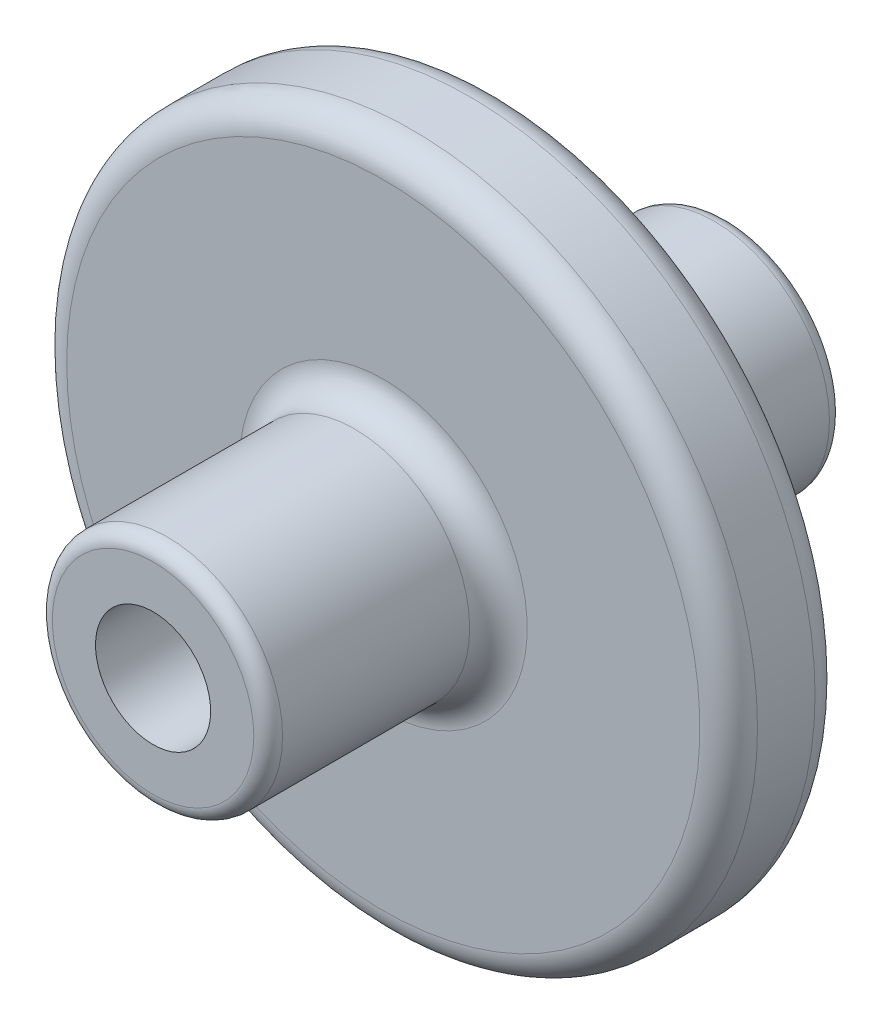
ISO-10303-21;
HEADER;
FILE_DESCRIPTION(('STEP AP214'),'2;1');
FILE_NAME('part.step','',(''),(''),'','','');
FILE_SCHEMA(('AUTOMOTIVE_DESIGN { 1 0 10303 214 1 1 1 1 }'));
ENDSEC;
DATA;
#1=APPLICATION_CONTEXT('core data for automotive mechanical design processes');
#2=APPLICATION_PROTOCOL_DEFINITION('international standard','automotive_design',2000,#1);
#3=PRODUCT_CONTEXT('',#1,'mechanical');
#4=PRODUCT('Part','Part','',(#3));
#5=PRODUCT_RELATED_PRODUCT_CATEGORY('part','',(#4));
#6=PRODUCT_DEFINITION_FORMATION('','',#4);
#7=PRODUCT_DEFINITION_CONTEXT('part definition',#1,'design');
#8=PRODUCT_DEFINITION('design','',#6,#7);
#9=PRODUCT_DEFINITION_SHAPE('','',#8);
#10=(LENGTH_UNIT() NAMED_UNIT(*) SI_UNIT(.MILLI.,.METRE.));
#11=(NAMED_UNIT(*) PLANE_ANGLE_UNIT() SI_UNIT($,.RADIAN.));
#12=(NAMED_UNIT(*) SI_UNIT($,.STERADIAN.) SOLID_ANGLE_UNIT());
#13=UNCERTAINTY_MEASURE_WITH_UNIT(LENGTH_MEASURE(1.E-05),#10,'distance_accuracy_value','');
#14=(GEOMETRIC_REPRESENTATION_CONTEXT(3) GLOBAL_UNCERTAINTY_ASSIGNED_CONTEXT((#13)) GLOBAL_UNIT_ASSIGNED_CONTEXT((#10,
#11,#12)) REPRESENTATION_CONTEXT('',''));
#15=CARTESIAN_POINT('',(0.,0.,0.));
#16=DIRECTION('',(0.,0.,1.));
#17=DIRECTION('',(1.,0.,0.));
#18=AXIS2_PLACEMENT_3D('',#15,#16,#17);
#19=CARTESIAN_POINT('',(0.,0.,-6.35));
#20=DIRECTION('',(0.,0.,1.));
#21=DIRECTION('',(1.,0.,0.));
#22=AXIS2_PLACEMENT_3D('',#19,#20,#21);
#23=CYLINDRICAL_SURFACE('',#22,3.175);
#24=CARTESIAN_POINT('',(0.,0.,-0.396875));
#25=DIRECTION('',(0.,0.,1.));
#26=DIRECTION('',(1.,0.,0.));
#27=AXIS2_PLACEMENT_3D('',#24,#25,#26);
#28=CIRCLE('',#27,3.175);
#29=CARTESIAN_POINT('',(3.175,0.,-0.396875));
#30=VERTEX_POINT('',#29);
#31=EDGE_CURVE('E10',#30,#30,#28,.F.);
#32=ORIENTED_EDGE('',*,*,#31,.T.);
#33=EDGE_LOOP('',(#32));
#34=FACE_BOUND('',#33,.T.);
#35=CARTESIAN_POINT('',(0.,0.,-5.55625));
#36=DIRECTION('',(0.,0.,-1.));
#37=DIRECTION('',(-1.,0.,0.));
#38=AXIS2_PLACEMENT_3D('',#35,#36,#37);
#39=CIRCLE('',#38,3.175);
#40=CARTESIAN_POINT('',(-3.175,0.,-5.55625));
#41=VERTEX_POINT('',#40);
#42=EDGE_CURVE('E65',#41,#41,#39,.F.);
#43=ORIENTED_EDGE('',*,*,#42,.T.);
#44=EDGE_LOOP('',(#43));
#45=FACE_BOUND('',#44,.T.);
#46=ADVANCED_FACE('F37',(#34,#45),#23,.T.);
#47=CARTESIAN_POINT('',(0.,0.,0.));
#48=DIRECTION('',(0.,0.,1.));
#49=DIRECTION('',(1.,0.,0.));
#50=AXIS2_PLACEMENT_3D('',#47,#48,#49);
#51=PLANE('',#50);
#52=CARTESIAN_POINT('',(0.,0.,0.));
#53=DIRECTION('',(0.,0.,1.));
#54=DIRECTION('',(1.,0.,0.));
#55=AXIS2_PLACEMENT_3D('',#52,#53,#54);
#56=CIRCLE('',#55,2.778125);
#57=CARTESIAN_POINT('',(2.778125,0.,0.));
#58=VERTEX_POINT('',#57);
#59=EDGE_CURVE('E45',#58,#58,#56,.T.);
#60=ORIENTED_EDGE('',*,*,#59,.T.);
#61=EDGE_LOOP('',(#60));
#62=FACE_BOUND('',#61,.T.);
#63=CARTESIAN_POINT('',(0.,0.,0.));
#64=DIRECTION('',(0.,0.,1.));
#65=DIRECTION('',(1.,0.,0.));
#66=AXIS2_PLACEMENT_3D('',#63,#64,#65);
#67=CIRCLE('',#66,1.5875);
#68=CARTESIAN_POINT('',(1.5875,0.,0.));
#69=VERTEX_POINT('',#68);
#70=EDGE_CURVE('E93',#69,#69,#67,.T.);
#71=ORIENTED_EDGE('',*,*,#70,.F.);
#72=EDGE_LOOP('',(#71));
#73=FACE_BOUND('',#72,.T.);
#74=ADVANCED_FACE('F107',(#62,#73),#51,.T.);
#75=CARTESIAN_POINT('',(0.,0.,-6.35));
#76=DIRECTION('',(0.,0.,1.));
#77=DIRECTION('',(1.,0.,0.));
#78=AXIS2_PLACEMENT_3D('',#75,#76,#77);
#79=CYLINDRICAL_SURFACE('',#78,1.5875);
#80=ORIENTED_EDGE('',*,*,#70,.T.);
#81=EDGE_LOOP('',(#80));
#82=FACE_BOUND('',#81,.T.);
#83=CARTESIAN_POINT('',(0.,0.,-15.875));
#84=DIRECTION('',(0.,0.,1.));
#85=DIRECTION('',(1.,0.,0.));
#86=AXIS2_PLACEMENT_3D('',#83,#84,#85);
#87=CIRCLE('',#86,1.5875);
#88=CARTESIAN_POINT('',(1.5875,0.,-15.875));
#89=VERTEX_POINT('',#88);
#90=EDGE_CURVE('E97',#89,#89,#87,.T.);
#91=ORIENTED_EDGE('',*,*,#90,.F.);
#92=EDGE_LOOP('',(#91));
#93=FACE_BOUND('',#92,.T.);
#94=ADVANCED_FACE('F104',(#82,#93),#79,.F.);
#95=CARTESIAN_POINT('',(0.,0.,-6.35));
#96=DIRECTION('',(0.,0.,-1.));
#97=DIRECTION('',(-1.,0.,0.));
#98=AXIS2_PLACEMENT_3D('',#95,#96,#97);
#99=PLANE('',#98);
#100=CARTESIAN_POINT('',(0.,0.,-6.35));
#101=DIRECTION('',(0.,0.,-1.));
#102=DIRECTION('',(-1.,0.,0.));
#103=AXIS2_PLACEMENT_3D('',#100,#101,#102);
#104=CIRCLE('',#103,3.96875);
#105=CARTESIAN_POINT('',(-3.96875,0.,-6.35));
#106=VERTEX_POINT('',#105);
#107=EDGE_CURVE('E61',#106,#106,#104,.T.);
#108=ORIENTED_EDGE('',*,*,#107,.T.);
#109=EDGE_LOOP('',(#108));
#110=FACE_BOUND('',#109,.T.);
#111=CARTESIAN_POINT('',(0.,0.,-6.35));
#112=DIRECTION('',(0.,0.,-1.));
#113=DIRECTION('',(-1.,0.,0.));
#114=AXIS2_PLACEMENT_3D('',#111,#112,#113);
#115=CIRCLE('',#114,8.73125);
#116=CARTESIAN_POINT('',(-8.73125,0.,-6.35));
#117=VERTEX_POINT('',#116);
#118=EDGE_CURVE('E77',#117,#117,#115,.F.);
#119=ORIENTED_EDGE('',*,*,#118,.T.);
#120=EDGE_LOOP('',(#119));
#121=FACE_BOUND('',#120,.T.);
#122=ADVANCED_FACE('F106',(#110,#121),#99,.F.);
#123=CARTESIAN_POINT('',(0.,0.,-7.9375));
#124=DIRECTION('',(0.,0.,1.));
#125=DIRECTION('',(1.,0.,0.));
#126=AXIS2_PLACEMENT_3D('',#123,#124,#125);
#127=CYLINDRICAL_SURFACE('',#126,9.525);
#128=CARTESIAN_POINT('',(0.,0.,-8.73125));
#129=DIRECTION('',(0.,0.,1.));
#130=DIRECTION('',(1.,0.,0.));
#131=AXIS2_PLACEMENT_3D('',#128,#129,#130);
#132=CIRCLE('',#131,9.525);
#133=CARTESIAN_POINT('',(9.525,0.,-8.73125));
#134=VERTEX_POINT('',#133);
#135=EDGE_CURVE('E81',#134,#134,#132,.T.);
#136=ORIENTED_EDGE('',*,*,#135,.T.);
#137=EDGE_LOOP('',(#136));
#138=FACE_BOUND('',#137,.T.);
#139=CARTESIAN_POINT('',(0.,0.,-7.14375));
#140=DIRECTION('',(0.,0.,-1.));
#141=DIRECTION('',(-1.,0.,0.));
#142=AXIS2_PLACEMENT_3D('',#139,#140,#141);
#143=CIRCLE('',#142,9.525);
#144=CARTESIAN_POINT('',(-9.525,0.,-7.14375));
#145=VERTEX_POINT('',#144);
#146=EDGE_CURVE('E85',#145,#145,#143,.T.);
#147=ORIENTED_EDGE('',*,*,#146,.T.);
#148=EDGE_LOOP('',(#147));
#149=FACE_BOUND('',#148,.T.);
#150=ADVANCED_FACE('F114',(#138,#149),#127,.T.);
#151=CARTESIAN_POINT('',(0.,0.,-9.525));
#152=DIRECTION('',(0.,0.,-1.));
#153=DIRECTION('',(1.,0.,0.));
#154=AXIS2_PLACEMENT_3D('',#151,#152,#153);
#155=CYLINDRICAL_SURFACE('',#154,3.175);
#156=CARTESIAN_POINT('',(0.,0.,-15.478125));
#157=DIRECTION('',(0.,0.,-1.));
#158=DIRECTION('',(-1.,0.,0.));
#159=AXIS2_PLACEMENT_3D('',#156,#157,#158);
#160=CIRCLE('',#159,3.175);
#161=CARTESIAN_POINT('',(-3.175,0.,-15.478125));
#162=VERTEX_POINT('',#161);
#163=EDGE_CURVE('E55',#162,#162,#160,.F.);
#164=ORIENTED_EDGE('',*,*,#163,.T.);
#165=EDGE_LOOP('',(#164));
#166=FACE_BOUND('',#165,.T.);
#167=CARTESIAN_POINT('',(0.,0.,-10.31875));
#168=DIRECTION('',(0.,0.,1.));
#169=DIRECTION('',(1.,0.,0.));
#170=AXIS2_PLACEMENT_3D('',#167,#168,#169);
#171=CIRCLE('',#170,3.175);
#172=CARTESIAN_POINT('',(3.175,0.,-10.31875));
#173=VERTEX_POINT('',#172);
#174=EDGE_CURVE('E69',#173,#173,#171,.F.);
#175=ORIENTED_EDGE('',*,*,#174,.T.);
#176=EDGE_LOOP('',(#175));
#177=FACE_BOUND('',#176,.T.);
#178=ADVANCED_FACE('F152',(#166,#177),#155,.T.);
#179=CARTESIAN_POINT('',(0.,0.,-15.875));
#180=DIRECTION('',(0.,0.,-1.));
#181=DIRECTION('',(1.,0.,0.));
#182=AXIS2_PLACEMENT_3D('',#179,#180,#181);
#183=PLANE('',#182);
#184=CARTESIAN_POINT('',(0.,0.,-15.875));
#185=DIRECTION('',(0.,0.,-1.));
#186=DIRECTION('',(-1.,0.,0.));
#187=AXIS2_PLACEMENT_3D('',#184,#185,#186);
#188=CIRCLE('',#187,2.778125);
#189=CARTESIAN_POINT('',(-2.778125,0.,-15.875));
#190=VERTEX_POINT('',#189);
#191=EDGE_CURVE('E50',#190,#190,#188,.T.);
#192=ORIENTED_EDGE('',*,*,#191,.T.);
#193=EDGE_LOOP('',(#192));
#194=FACE_BOUND('',#193,.T.);
#195=ORIENTED_EDGE('',*,*,#90,.T.);
#196=EDGE_LOOP('',(#195));
#197=FACE_BOUND('',#196,.T.);
#198=ADVANCED_FACE('F102',(#194,#197),#183,.T.);
#199=CARTESIAN_POINT('',(0.,0.,-9.525));
#200=DIRECTION('',(0.,0.,1.));
#201=DIRECTION('',(-1.,0.,0.));
#202=AXIS2_PLACEMENT_3D('',#199,#200,#201);
#203=PLANE('',#202);
#204=CARTESIAN_POINT('',(0.,0.,-9.525));
#205=DIRECTION('',(0.,0.,1.));
#206=DIRECTION('',(1.,0.,0.));
#207=AXIS2_PLACEMENT_3D('',#204,#205,#206);
#208=CIRCLE('',#207,3.96875);
#209=CARTESIAN_POINT('',(3.96875,0.,-9.525));
#210=VERTEX_POINT('',#209);
#211=EDGE_CURVE('E73',#210,#210,#208,.T.);
#212=ORIENTED_EDGE('',*,*,#211,.T.);
#213=EDGE_LOOP('',(#212));
#214=FACE_BOUND('',#213,.T.);
#215=CARTESIAN_POINT('',(0.,0.,-9.525));
#216=DIRECTION('',(0.,0.,1.));
#217=DIRECTION('',(1.,0.,0.));
#218=AXIS2_PLACEMENT_3D('',#215,#216,#217);
#219=CIRCLE('',#218,8.73125);
#220=CARTESIAN_POINT('',(8.73125,0.,-9.525));
#221=VERTEX_POINT('',#220);
#222=EDGE_CURVE('E89',#221,#221,#219,.F.);
#223=ORIENTED_EDGE('',*,*,#222,.T.);
#224=EDGE_LOOP('',(#223));
#225=FACE_BOUND('',#224,.T.);
#226=ADVANCED_FACE('F129',(#214,#225),#203,.F.);
#227=CARTESIAN_POINT('',(0.,0.,-8.73125));
#228=DIRECTION('',(0.,0.,1.));
#229=DIRECTION('',(1.,0.,0.));
#230=AXIS2_PLACEMENT_3D('',#227,#228,#229);
#231=TOROIDAL_SURFACE('',#230,8.73125,0.79375);
#232=ORIENTED_EDGE('',*,*,#135,.F.);
#233=EDGE_LOOP('',(#232));
#234=FACE_BOUND('',#233,.T.);
#235=ORIENTED_EDGE('',*,*,#222,.F.);
#236=EDGE_LOOP('',(#235));
#237=FACE_BOUND('',#236,.T.);
#238=ADVANCED_FACE('F125',(#234,#237),#231,.T.);
#239=CARTESIAN_POINT('',(0.,0.,-7.14375));
#240=DIRECTION('',(0.,0.,-1.));
#241=DIRECTION('',(-1.,0.,0.));
#242=AXIS2_PLACEMENT_3D('',#239,#240,#241);
#243=TOROIDAL_SURFACE('',#242,8.73125,0.79375);
#244=ORIENTED_EDGE('',*,*,#118,.F.);
#245=EDGE_LOOP('',(#244));
#246=FACE_BOUND('',#245,.T.);
#247=ORIENTED_EDGE('',*,*,#146,.F.);
#248=EDGE_LOOP('',(#247));
#249=FACE_BOUND('',#248,.T.);
#250=ADVANCED_FACE('F128',(#246,#249),#243,.T.);
#251=CARTESIAN_POINT('',(0.,0.,-10.31875));
#252=DIRECTION('',(0.,0.,1.));
#253=DIRECTION('',(1.,0.,0.));
#254=AXIS2_PLACEMENT_3D('',#251,#252,#253);
#255=TOROIDAL_SURFACE('',#254,3.96875,0.79375);
#256=ORIENTED_EDGE('',*,*,#174,.F.);
#257=EDGE_LOOP('',(#256));
#258=FACE_BOUND('',#257,.T.);
#259=ORIENTED_EDGE('',*,*,#211,.F.);
#260=EDGE_LOOP('',(#259));
#261=FACE_BOUND('',#260,.T.);
#262=ADVANCED_FACE('F133',(#258,#261),#255,.F.);
#263=CARTESIAN_POINT('',(0.,0.,-5.55625));
#264=DIRECTION('',(0.,0.,-1.));
#265=DIRECTION('',(-1.,0.,0.));
#266=AXIS2_PLACEMENT_3D('',#263,#264,#265);
#267=TOROIDAL_SURFACE('',#266,3.96875,0.79375);
#268=ORIENTED_EDGE('',*,*,#107,.F.);
#269=EDGE_LOOP('',(#268));
#270=FACE_BOUND('',#269,.T.);
#271=ORIENTED_EDGE('',*,*,#42,.F.);
#272=EDGE_LOOP('',(#271));
#273=FACE_BOUND('',#272,.T.);
#274=ADVANCED_FACE('F137',(#270,#273),#267,.F.);
#275=CARTESIAN_POINT('',(0.,0.,-15.478125));
#276=DIRECTION('',(0.,0.,-1.));
#277=DIRECTION('',(-1.,0.,0.));
#278=AXIS2_PLACEMENT_3D('',#275,#276,#277);
#279=TOROIDAL_SURFACE('',#278,2.778125,0.396875);
#280=ORIENTED_EDGE('',*,*,#191,.F.);
#281=EDGE_LOOP('',(#280));
#282=FACE_BOUND('',#281,.T.);
#283=ORIENTED_EDGE('',*,*,#163,.F.);
#284=EDGE_LOOP('',(#283));
#285=FACE_BOUND('',#284,.T.);
#286=ADVANCED_FACE('F140',(#282,#285),#279,.T.);
#287=CARTESIAN_POINT('',(0.,0.,-0.396875));
#288=DIRECTION('',(0.,0.,1.));
#289=DIRECTION('',(1.,0.,0.));
#290=AXIS2_PLACEMENT_3D('',#287,#288,#289);
#291=TOROIDAL_SURFACE('',#290,2.778125,0.396875);
#292=ORIENTED_EDGE('',*,*,#31,.F.);
#293=EDGE_LOOP('',(#292));
#294=FACE_BOUND('',#293,.T.);
#295=ORIENTED_EDGE('',*,*,#59,.F.);
#296=EDGE_LOOP('',(#295));
#297=FACE_BOUND('',#296,.T.);
#298=ADVANCED_FACE('F39',(#294,#297),#291,.T.);
#299=CLOSED_SHELL('',(#46,#74,#94,#122,#150,#178,#198,#226,#238,#250,#262,#274,#286,#298));
#300=MANIFOLD_SOLID_BREP('B2',#299);
#301=ADVANCED_BREP_SHAPE_REPRESENTATION('',(#18,#300),#14);
#302=SHAPE_DEFINITION_REPRESENTATION(#9,#301);
ENDSEC;
END-ISO-10303-21;
